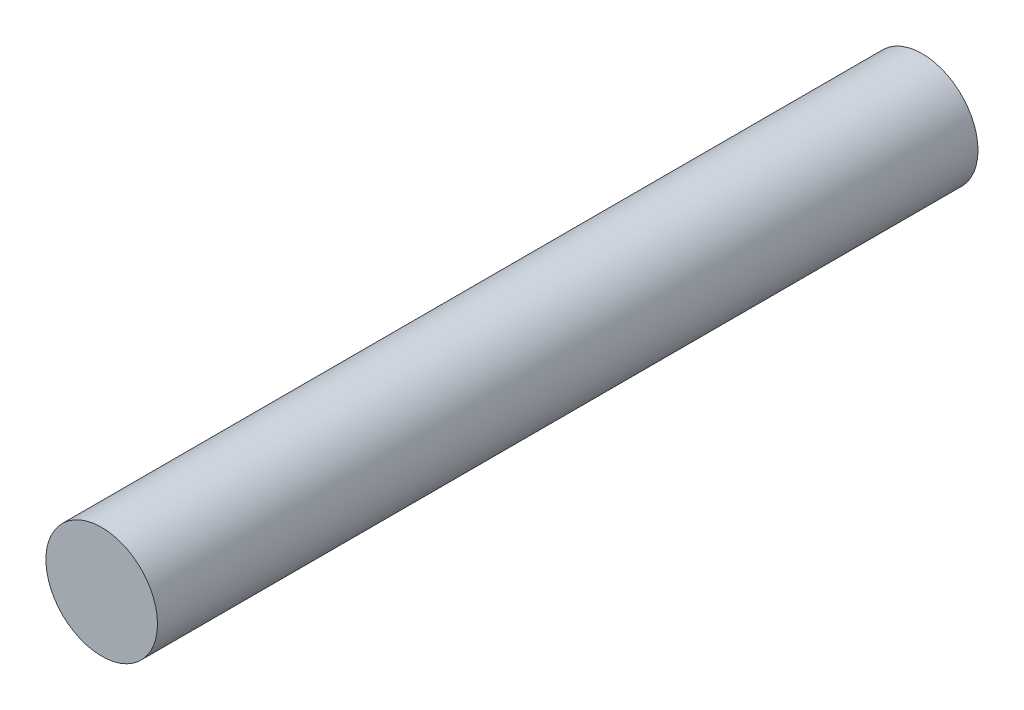
ISO-10303-21;
HEADER;
FILE_DESCRIPTION(('STEP AP214'),'2;1');
FILE_NAME('part.step','',(''),(''),'','','');
FILE_SCHEMA(('AUTOMOTIVE_DESIGN { 1 0 10303 214 1 1 1 1 }'));
ENDSEC;
DATA;
#1=APPLICATION_CONTEXT('core data for automotive mechanical design processes');
#2=APPLICATION_PROTOCOL_DEFINITION('international standard','automotive_design',2000,#1);
#3=PRODUCT_CONTEXT('',#1,'mechanical');
#4=PRODUCT('Part','Part','',(#3));
#5=PRODUCT_RELATED_PRODUCT_CATEGORY('part','',(#4));
#6=PRODUCT_DEFINITION_FORMATION('','',#4);
#7=PRODUCT_DEFINITION_CONTEXT('part definition',#1,'design');
#8=PRODUCT_DEFINITION('design','',#6,#7);
#9=PRODUCT_DEFINITION_SHAPE('','',#8);
#10=(LENGTH_UNIT() NAMED_UNIT(*) SI_UNIT(.MILLI.,.METRE.));
#11=(NAMED_UNIT(*) PLANE_ANGLE_UNIT() SI_UNIT($,.RADIAN.));
#12=(NAMED_UNIT(*) SI_UNIT($,.STERADIAN.) SOLID_ANGLE_UNIT());
#13=UNCERTAINTY_MEASURE_WITH_UNIT(LENGTH_MEASURE(1.E-05),#10,'distance_accuracy_value','');
#14=(GEOMETRIC_REPRESENTATION_CONTEXT(3) GLOBAL_UNCERTAINTY_ASSIGNED_CONTEXT((#13)) GLOBAL_UNIT_ASSIGNED_CONTEXT((#10,
#11,#12)) REPRESENTATION_CONTEXT('',''));
#15=CARTESIAN_POINT('',(0.,0.,0.));
#16=DIRECTION('',(0.,0.,1.));
#17=DIRECTION('',(1.,0.,0.));
#18=AXIS2_PLACEMENT_3D('',#15,#16,#17);
#19=CARTESIAN_POINT('',(-9.73466594293583,-1.0503708102803,25.));
#20=DIRECTION('',(0.,0.,-1.));
#21=DIRECTION('',(-1.,0.,0.));
#22=AXIS2_PLACEMENT_3D('',#19,#20,#21);
#23=CYLINDRICAL_SURFACE('',#22,1.7);
#24=CARTESIAN_POINT('',(-9.73466594293583,-1.0503708102803,25.));
#25=DIRECTION('',(0.,0.,1.));
#26=DIRECTION('',(1.,0.,0.));
#27=AXIS2_PLACEMENT_3D('',#24,#25,#26);
#28=CIRCLE('',#27,1.7);
#29=CARTESIAN_POINT('',(-8.03466594293583,-1.0503708102803,25.));
#30=VERTEX_POINT('',#29);
#31=EDGE_CURVE('E10',#30,#30,#28,.T.);
#32=ORIENTED_EDGE('',*,*,#31,.F.);
#33=EDGE_LOOP('',(#32));
#34=FACE_BOUND('',#33,.T.);
#35=CARTESIAN_POINT('',(-9.73466594293583,-1.0503708102803,0.));
#36=DIRECTION('',(0.,0.,1.));
#37=DIRECTION('',(1.,0.,0.));
#38=AXIS2_PLACEMENT_3D('',#35,#36,#37);
#39=CIRCLE('',#38,1.7);
#40=CARTESIAN_POINT('',(-8.03466594293583,-1.0503708102803,0.));
#41=VERTEX_POINT('',#40);
#42=EDGE_CURVE('E39',#41,#41,#39,.T.);
#43=ORIENTED_EDGE('',*,*,#42,.T.);
#44=EDGE_LOOP('',(#43));
#45=FACE_BOUND('',#44,.T.);
#46=ADVANCED_FACE('F36',(#34,#45),#23,.T.);
#47=CARTESIAN_POINT('',(-9.73466594293583,-1.0503708102803,25.));
#48=DIRECTION('',(0.,0.,1.));
#49=DIRECTION('',(1.,0.,0.));
#50=AXIS2_PLACEMENT_3D('',#47,#48,#49);
#51=PLANE('',#50);
#52=ORIENTED_EDGE('',*,*,#31,.T.);
#53=EDGE_LOOP('',(#52));
#54=FACE_BOUND('',#53,.T.);
#55=ADVANCED_FACE('F51',(#54),#51,.T.);
#56=CARTESIAN_POINT('',(-9.73466594293583,-1.0503708102803,0.));
#57=DIRECTION('',(0.,0.,1.));
#58=DIRECTION('',(1.,0.,0.));
#59=AXIS2_PLACEMENT_3D('',#56,#57,#58);
#60=PLANE('',#59);
#61=ORIENTED_EDGE('',*,*,#42,.F.);
#62=EDGE_LOOP('',(#61));
#63=FACE_BOUND('',#62,.T.);
#64=ADVANCED_FACE('F49',(#63),#60,.F.);
#65=CLOSED_SHELL('',(#46,#55,#64));
#66=MANIFOLD_SOLID_BREP('B2',#65);
#67=ADVANCED_BREP_SHAPE_REPRESENTATION('',(#18,#66),#14);
#68=SHAPE_DEFINITION_REPRESENTATION(#9,#67);
ENDSEC;
END-ISO-10303-21;
